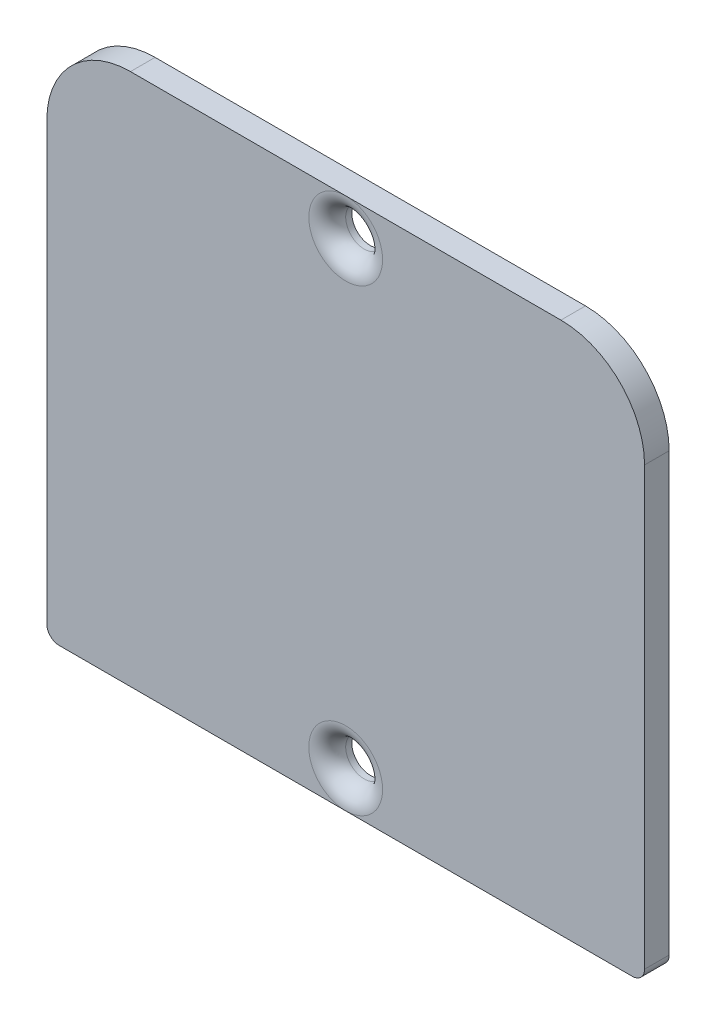
ISO-10303-21;
HEADER;
FILE_DESCRIPTION(('STEP AP214'),'2;1');
FILE_NAME('part.step','',(''),(''),'','','');
FILE_SCHEMA(('AUTOMOTIVE_DESIGN { 1 0 10303 214 1 1 1 1 }'));
ENDSEC;
DATA;
#1=APPLICATION_CONTEXT('core data for automotive mechanical design processes');
#2=APPLICATION_PROTOCOL_DEFINITION('international standard','automotive_design',2000,#1);
#3=PRODUCT_CONTEXT('',#1,'mechanical');
#4=PRODUCT('Part','Part','',(#3));
#5=PRODUCT_RELATED_PRODUCT_CATEGORY('part','',(#4));
#6=PRODUCT_DEFINITION_FORMATION('','',#4);
#7=PRODUCT_DEFINITION_CONTEXT('part definition',#1,'design');
#8=PRODUCT_DEFINITION('design','',#6,#7);
#9=PRODUCT_DEFINITION_SHAPE('','',#8);
#10=(LENGTH_UNIT() NAMED_UNIT(*) SI_UNIT(.MILLI.,.METRE.));
#11=(NAMED_UNIT(*) PLANE_ANGLE_UNIT() SI_UNIT($,.RADIAN.));
#12=(NAMED_UNIT(*) SI_UNIT($,.STERADIAN.) SOLID_ANGLE_UNIT());
#13=UNCERTAINTY_MEASURE_WITH_UNIT(LENGTH_MEASURE(1.E-05),#10,'distance_accuracy_value','');
#14=(GEOMETRIC_REPRESENTATION_CONTEXT(3) GLOBAL_UNCERTAINTY_ASSIGNED_CONTEXT((#13)) GLOBAL_UNIT_ASSIGNED_CONTEXT((#10,
#11,#12)) REPRESENTATION_CONTEXT('',''));
#15=CARTESIAN_POINT('',(0.,0.,0.));
#16=DIRECTION('',(0.,0.,1.));
#17=DIRECTION('',(1.,0.,0.));
#18=AXIS2_PLACEMENT_3D('',#15,#16,#17);
#19=CARTESIAN_POINT('',(-26.7639444422996,27.3351694915254,2.));
#20=DIRECTION('',(1.,0.,0.));
#21=DIRECTION('',(0.,1.,0.));
#22=AXIS2_PLACEMENT_3D('',#19,#20,#21);
#23=PLANE('',#22);
#24=DIRECTION('',(0.,-1.,0.));
#25=VECTOR('',#24,1.);
#26=CARTESIAN_POINT('',(-26.7639444422996,27.3351694915254,0.));
#27=LINE('',#26,#25);
#28=CARTESIAN_POINT('',(-26.7639444422996,20.5351694915254,0.));
#29=VERTEX_POINT('',#28);
#30=CARTESIAN_POINT('',(-26.7639444422996,-14.9748305084746,0.));
#31=VERTEX_POINT('',#30);
#32=EDGE_CURVE('E128',#29,#31,#27,.T.);
#33=ORIENTED_EDGE('',*,*,#32,.T.);
#34=DIRECTION('',(0.,0.,-1.));
#35=VECTOR('',#34,1.);
#36=CARTESIAN_POINT('',(-26.7639444422996,-14.9748305084746,2.));
#37=LINE('',#36,#35);
#38=CARTESIAN_POINT('',(-26.7639444422996,-14.9748305084746,2.));
#39=VERTEX_POINT('',#38);
#40=EDGE_CURVE('E200',#31,#39,#37,.F.);
#41=ORIENTED_EDGE('',*,*,#40,.T.);
#42=DIRECTION('',(0.,-1.,0.));
#43=VECTOR('',#42,1.);
#44=CARTESIAN_POINT('',(-26.7639444422996,27.3351694915254,2.));
#45=LINE('',#44,#43);
#46=CARTESIAN_POINT('',(-26.7639444422996,20.5351694915254,2.));
#47=VERTEX_POINT('',#46);
#48=EDGE_CURVE('E131',#47,#39,#45,.T.);
#49=ORIENTED_EDGE('',*,*,#48,.F.);
#50=DIRECTION('',(0.,0.,-1.));
#51=VECTOR('',#50,1.);
#52=CARTESIAN_POINT('',(-26.7639444422996,20.5351694915254,2.));
#53=LINE('',#52,#51);
#54=EDGE_CURVE('E114',#47,#29,#53,.T.);
#55=ORIENTED_EDGE('',*,*,#54,.T.);
#56=EDGE_LOOP('',(#33,#41,#49,#55));
#57=FACE_BOUND('',#56,.T.);
#58=ADVANCED_FACE('F42',(#57),#23,.F.);
#59=CARTESIAN_POINT('',(-26.7639444422996,-15.9748305084746,2.));
#60=DIRECTION('',(0.,1.,0.));
#61=DIRECTION('',(0.,0.,1.));
#62=AXIS2_PLACEMENT_3D('',#59,#60,#61);
#63=PLANE('',#62);
#64=DIRECTION('',(1.,0.,0.));
#65=VECTOR('',#64,1.);
#66=CARTESIAN_POINT('',(-26.7639444422996,-15.9748305084746,0.));
#67=LINE('',#66,#65);
#68=CARTESIAN_POINT('',(-25.7639444422995,-15.9748305084746,0.));
#69=VERTEX_POINT('',#68);
#70=CARTESIAN_POINT('',(20.8360555577005,-15.9748305084746,0.));
#71=VERTEX_POINT('',#70);
#72=EDGE_CURVE('E140',#69,#71,#67,.T.);
#73=ORIENTED_EDGE('',*,*,#72,.T.);
#74=DIRECTION('',(0.,0.,-1.));
#75=VECTOR('',#74,1.);
#76=CARTESIAN_POINT('',(20.8360555577005,-15.9748305084746,2.));
#77=LINE('',#76,#75);
#78=CARTESIAN_POINT('',(20.8360555577005,-15.9748305084746,2.));
#79=VERTEX_POINT('',#78);
#80=EDGE_CURVE('E190',#71,#79,#77,.F.);
#81=ORIENTED_EDGE('',*,*,#80,.T.);
#82=DIRECTION('',(1.,0.,0.));
#83=VECTOR('',#82,1.);
#84=CARTESIAN_POINT('',(-26.7639444422996,-15.9748305084746,2.));
#85=LINE('',#84,#83);
#86=CARTESIAN_POINT('',(-2.46394444229955,-15.9748305084746,2.));
#87=VERTEX_POINT('',#86);
#88=EDGE_CURVE('E261',#87,#79,#85,.T.);
#89=ORIENTED_EDGE('',*,*,#88,.F.);
#90=CARTESIAN_POINT('',(-25.7639444422995,-15.9748305084746,2.));
#91=VERTEX_POINT('',#90);
#92=EDGE_CURVE('E259',#91,#87,#85,.T.);
#93=ORIENTED_EDGE('',*,*,#92,.F.);
#94=DIRECTION('',(0.,0.,-1.));
#95=VECTOR('',#94,1.);
#96=CARTESIAN_POINT('',(-25.7639444422995,-15.9748305084746,2.));
#97=LINE('',#96,#95);
#98=EDGE_CURVE('E186',#91,#69,#97,.T.);
#99=ORIENTED_EDGE('',*,*,#98,.T.);
#100=EDGE_LOOP('',(#73,#81,#89,#93,#99));
#101=FACE_BOUND('',#100,.T.);
#102=ADVANCED_FACE('F225',(#101),#63,.F.);
#103=CARTESIAN_POINT('',(21.8360555577005,27.3351694915254,2.));
#104=DIRECTION('',(-1.,0.,0.));
#105=DIRECTION('',(0.,0.,1.));
#106=AXIS2_PLACEMENT_3D('',#103,#104,#105);
#107=PLANE('',#106);
#108=DIRECTION('',(0.,1.,0.));
#109=VECTOR('',#108,1.);
#110=CARTESIAN_POINT('',(21.8360555577005,27.3351694915254,2.));
#111=LINE('',#110,#109);
#112=CARTESIAN_POINT('',(21.8360555577005,-14.9748305084746,2.));
#113=VERTEX_POINT('',#112);
#114=CARTESIAN_POINT('',(21.8360555577005,20.5351694915254,2.));
#115=VERTEX_POINT('',#114);
#116=EDGE_CURVE('E263',#113,#115,#111,.T.);
#117=ORIENTED_EDGE('',*,*,#116,.F.);
#118=DIRECTION('',(0.,0.,-1.));
#119=VECTOR('',#118,1.);
#120=CARTESIAN_POINT('',(21.8360555577005,-14.9748305084746,2.));
#121=LINE('',#120,#119);
#122=CARTESIAN_POINT('',(21.8360555577005,-14.9748305084746,0.));
#123=VERTEX_POINT('',#122);
#124=EDGE_CURVE('E177',#113,#123,#121,.T.);
#125=ORIENTED_EDGE('',*,*,#124,.T.);
#126=DIRECTION('',(0.,1.,0.));
#127=VECTOR('',#126,1.);
#128=CARTESIAN_POINT('',(21.8360555577005,27.3351694915254,0.));
#129=LINE('',#128,#127);
#130=CARTESIAN_POINT('',(21.8360555577005,20.5351694915254,0.));
#131=VERTEX_POINT('',#130);
#132=EDGE_CURVE('E146',#123,#131,#129,.T.);
#133=ORIENTED_EDGE('',*,*,#132,.T.);
#134=DIRECTION('',(0.,0.,-1.));
#135=VECTOR('',#134,1.);
#136=CARTESIAN_POINT('',(21.8360555577005,20.5351694915254,2.));
#137=LINE('',#136,#135);
#138=EDGE_CURVE('E173',#131,#115,#137,.F.);
#139=ORIENTED_EDGE('',*,*,#138,.T.);
#140=EDGE_LOOP('',(#117,#125,#133,#139));
#141=FACE_BOUND('',#140,.T.);
#142=ADVANCED_FACE('F231',(#141),#107,.F.);
#143=CARTESIAN_POINT('',(-26.7639444422996,27.3351694915254,2.));
#144=DIRECTION('',(0.,-1.,0.));
#145=DIRECTION('',(0.,0.,-1.));
#146=AXIS2_PLACEMENT_3D('',#143,#144,#145);
#147=PLANE('',#146);
#148=DIRECTION('',(-1.,0.,0.));
#149=VECTOR('',#148,1.);
#150=CARTESIAN_POINT('',(-26.7639444422996,27.3351694915254,0.));
#151=LINE('',#150,#149);
#152=CARTESIAN_POINT('',(15.0360555577005,27.3351694915254,0.));
#153=VERTEX_POINT('',#152);
#154=CARTESIAN_POINT('',(-19.9639444422996,27.3351694915254,0.));
#155=VERTEX_POINT('',#154);
#156=EDGE_CURVE('E156',#153,#155,#151,.T.);
#157=ORIENTED_EDGE('',*,*,#156,.T.);
#158=DIRECTION('',(0.,0.,-1.));
#159=VECTOR('',#158,1.);
#160=CARTESIAN_POINT('',(-19.9639444422996,27.3351694915254,2.));
#161=LINE('',#160,#159);
#162=CARTESIAN_POINT('',(-19.9639444422996,27.3351694915254,2.));
#163=VERTEX_POINT('',#162);
#164=EDGE_CURVE('E116',#155,#163,#161,.F.);
#165=ORIENTED_EDGE('',*,*,#164,.T.);
#166=DIRECTION('',(-1.,0.,0.));
#167=VECTOR('',#166,1.);
#168=CARTESIAN_POINT('',(-26.7639444422996,27.3351694915254,2.));
#169=LINE('',#168,#167);
#170=CARTESIAN_POINT('',(-2.46394444229955,27.3351694915254,2.));
#171=VERTEX_POINT('',#170);
#172=EDGE_CURVE('E267',#171,#163,#169,.T.);
#173=ORIENTED_EDGE('',*,*,#172,.F.);
#174=CARTESIAN_POINT('',(15.0360555577005,27.3351694915254,2.));
#175=VERTEX_POINT('',#174);
#176=EDGE_CURVE('E133',#175,#171,#169,.T.);
#177=ORIENTED_EDGE('',*,*,#176,.F.);
#178=DIRECTION('',(0.,0.,-1.));
#179=VECTOR('',#178,1.);
#180=CARTESIAN_POINT('',(15.0360555577005,27.3351694915254,2.));
#181=LINE('',#180,#179);
#182=EDGE_CURVE('E122',#175,#153,#181,.T.);
#183=ORIENTED_EDGE('',*,*,#182,.T.);
#184=EDGE_LOOP('',(#157,#165,#173,#177,#183));
#185=FACE_BOUND('',#184,.T.);
#186=ADVANCED_FACE('F282',(#185),#147,.F.);
#187=CARTESIAN_POINT('',(0.,0.,2.));
#188=DIRECTION('',(0.,0.,1.));
#189=DIRECTION('',(1.,0.,0.));
#190=AXIS2_PLACEMENT_3D('',#187,#188,#189);
#191=PLANE('',#190);
#192=ORIENTED_EDGE('',*,*,#92,.T.);
#193=CARTESIAN_POINT('',(-2.46394444229955,-12.9748305084746,2.));
#194=DIRECTION('',(0.,0.,1.));
#195=DIRECTION('',(1.,0.,0.));
#196=AXIS2_PLACEMENT_3D('',#193,#194,#195);
#197=CIRCLE('',#196,3.);
#198=EDGE_CURVE('E11',#87,#87,#197,.F.);
#199=ORIENTED_EDGE('',*,*,#198,.T.);
#200=ORIENTED_EDGE('',*,*,#88,.T.);
#201=CARTESIAN_POINT('',(20.8360555577005,-14.9748305084746,2.));
#202=DIRECTION('',(0.,0.,1.));
#203=DIRECTION('',(1.,0.,0.));
#204=AXIS2_PLACEMENT_3D('',#201,#202,#203);
#205=CIRCLE('',#204,1.);
#206=EDGE_CURVE('E197',#79,#113,#205,.T.);
#207=ORIENTED_EDGE('',*,*,#206,.T.);
#208=ORIENTED_EDGE('',*,*,#116,.T.);
#209=CARTESIAN_POINT('',(15.0360555577005,20.5351694915254,2.));
#210=DIRECTION('',(0.,0.,1.));
#211=DIRECTION('',(1.,0.,0.));
#212=AXIS2_PLACEMENT_3D('',#209,#210,#211);
#213=CIRCLE('',#212,6.8);
#214=EDGE_CURVE('E167',#115,#175,#213,.T.);
#215=ORIENTED_EDGE('',*,*,#214,.T.);
#216=ORIENTED_EDGE('',*,*,#176,.T.);
#217=CARTESIAN_POINT('',(-2.46394444229955,24.3351694915254,2.));
#218=DIRECTION('',(0.,0.,1.));
#219=DIRECTION('',(1.,0.,0.));
#220=AXIS2_PLACEMENT_3D('',#217,#218,#219);
#221=CIRCLE('',#220,3.);
#222=EDGE_CURVE('E59',#171,#171,#221,.F.);
#223=ORIENTED_EDGE('',*,*,#222,.T.);
#224=ORIENTED_EDGE('',*,*,#172,.T.);
#225=CARTESIAN_POINT('',(-19.9639444422996,20.5351694915254,2.));
#226=DIRECTION('',(0.,0.,1.));
#227=DIRECTION('',(1.,0.,0.));
#228=AXIS2_PLACEMENT_3D('',#225,#226,#227);
#229=CIRCLE('',#228,6.8);
#230=EDGE_CURVE('E170',#163,#47,#229,.T.);
#231=ORIENTED_EDGE('',*,*,#230,.T.);
#232=ORIENTED_EDGE('',*,*,#48,.T.);
#233=CARTESIAN_POINT('',(-25.7639444422995,-14.9748305084746,2.));
#234=DIRECTION('',(0.,0.,1.));
#235=DIRECTION('',(1.,0.,0.));
#236=AXIS2_PLACEMENT_3D('',#233,#234,#235);
#237=CIRCLE('',#236,1.);
#238=EDGE_CURVE('E194',#39,#91,#237,.T.);
#239=ORIENTED_EDGE('',*,*,#238,.T.);
#240=EDGE_LOOP('',(#192,#199,#200,#207,#208,#215,#216,#223,#224,#231,#232,#239));
#241=FACE_BOUND('',#240,.T.);
#242=ADVANCED_FACE('F258',(#241),#191,.T.);
#243=CARTESIAN_POINT('',(0.,0.,0.));
#244=DIRECTION('',(0.,0.,1.));
#245=DIRECTION('',(1.,0.,0.));
#246=AXIS2_PLACEMENT_3D('',#243,#244,#245);
#247=PLANE('',#246);
#248=CARTESIAN_POINT('',(-2.46394444229955,24.3351694915254,0.));
#249=DIRECTION('',(0.,0.,1.));
#250=DIRECTION('',(1.,0.,0.));
#251=AXIS2_PLACEMENT_3D('',#248,#249,#250);
#252=CIRCLE('',#251,1.5);
#253=CARTESIAN_POINT('',(-0.963944442299545,24.3351694915254,0.));
#254=VERTEX_POINT('',#253);
#255=EDGE_CURVE('E141',#254,#254,#252,.T.);
#256=ORIENTED_EDGE('',*,*,#255,.T.);
#257=EDGE_LOOP('',(#256));
#258=FACE_BOUND('',#257,.T.);
#259=CARTESIAN_POINT('',(-2.46394444229955,-12.9748305084746,0.));
#260=DIRECTION('',(0.,0.,1.));
#261=DIRECTION('',(1.,0.,0.));
#262=AXIS2_PLACEMENT_3D('',#259,#260,#261);
#263=CIRCLE('',#262,1.5);
#264=CARTESIAN_POINT('',(-0.963944442299547,-12.9748305084746,0.));
#265=VERTEX_POINT('',#264);
#266=EDGE_CURVE('E149',#265,#265,#263,.T.);
#267=ORIENTED_EDGE('',*,*,#266,.T.);
#268=EDGE_LOOP('',(#267));
#269=FACE_BOUND('',#268,.T.);
#270=ORIENTED_EDGE('',*,*,#132,.F.);
#271=CARTESIAN_POINT('',(20.8360555577005,-14.9748305084746,0.));
#272=DIRECTION('',(0.,0.,1.));
#273=DIRECTION('',(1.,0.,0.));
#274=AXIS2_PLACEMENT_3D('',#271,#272,#273);
#275=CIRCLE('',#274,1.);
#276=EDGE_CURVE('E183',#123,#71,#275,.F.);
#277=ORIENTED_EDGE('',*,*,#276,.T.);
#278=ORIENTED_EDGE('',*,*,#72,.F.);
#279=CARTESIAN_POINT('',(-25.7639444422995,-14.9748305084746,0.));
#280=DIRECTION('',(0.,0.,1.));
#281=DIRECTION('',(1.,0.,0.));
#282=AXIS2_PLACEMENT_3D('',#279,#280,#281);
#283=CIRCLE('',#282,1.);
#284=EDGE_CURVE('E138',#69,#31,#283,.F.);
#285=ORIENTED_EDGE('',*,*,#284,.T.);
#286=ORIENTED_EDGE('',*,*,#32,.F.);
#287=CARTESIAN_POINT('',(-19.9639444422996,20.5351694915254,0.));
#288=DIRECTION('',(0.,0.,1.));
#289=DIRECTION('',(1.,0.,0.));
#290=AXIS2_PLACEMENT_3D('',#287,#288,#289);
#291=CIRCLE('',#290,6.8);
#292=EDGE_CURVE('E110',#29,#155,#291,.F.);
#293=ORIENTED_EDGE('',*,*,#292,.T.);
#294=ORIENTED_EDGE('',*,*,#156,.F.);
#295=CARTESIAN_POINT('',(15.0360555577005,20.5351694915254,0.));
#296=DIRECTION('',(0.,0.,1.));
#297=DIRECTION('',(1.,0.,0.));
#298=AXIS2_PLACEMENT_3D('',#295,#296,#297);
#299=CIRCLE('',#298,6.8);
#300=EDGE_CURVE('E123',#153,#131,#299,.F.);
#301=ORIENTED_EDGE('',*,*,#300,.T.);
#302=EDGE_LOOP('',(#270,#277,#278,#285,#286,#293,#294,#301));
#303=FACE_BOUND('',#302,.T.);
#304=ADVANCED_FACE('F136',(#258,#269,#303),#247,.F.);
#305=CARTESIAN_POINT('',(-19.9639444422996,20.5351694915254,2.));
#306=DIRECTION('',(0.,0.,-1.));
#307=DIRECTION('',(-1.,0.,0.));
#308=AXIS2_PLACEMENT_3D('',#305,#306,#307);
#309=CYLINDRICAL_SURFACE('',#308,6.8);
#310=ORIENTED_EDGE('',*,*,#230,.F.);
#311=ORIENTED_EDGE('',*,*,#164,.F.);
#312=ORIENTED_EDGE('',*,*,#292,.F.);
#313=ORIENTED_EDGE('',*,*,#54,.F.);
#314=EDGE_LOOP('',(#310,#311,#312,#313));
#315=FACE_BOUND('',#314,.T.);
#316=ADVANCED_FACE('F113',(#315),#309,.T.);
#317=CARTESIAN_POINT('',(15.0360555577005,20.5351694915254,2.));
#318=DIRECTION('',(0.,0.,-1.));
#319=DIRECTION('',(-1.,0.,0.));
#320=AXIS2_PLACEMENT_3D('',#317,#318,#319);
#321=CYLINDRICAL_SURFACE('',#320,6.8);
#322=ORIENTED_EDGE('',*,*,#214,.F.);
#323=ORIENTED_EDGE('',*,*,#138,.F.);
#324=ORIENTED_EDGE('',*,*,#300,.F.);
#325=ORIENTED_EDGE('',*,*,#182,.F.);
#326=EDGE_LOOP('',(#322,#323,#324,#325));
#327=FACE_BOUND('',#326,.T.);
#328=ADVANCED_FACE('F238',(#327),#321,.T.);
#329=CARTESIAN_POINT('',(20.8360555577005,-14.9748305084746,2.));
#330=DIRECTION('',(0.,0.,-1.));
#331=DIRECTION('',(-1.,0.,0.));
#332=AXIS2_PLACEMENT_3D('',#329,#330,#331);
#333=CYLINDRICAL_SURFACE('',#332,1.);
#334=ORIENTED_EDGE('',*,*,#206,.F.);
#335=ORIENTED_EDGE('',*,*,#80,.F.);
#336=ORIENTED_EDGE('',*,*,#276,.F.);
#337=ORIENTED_EDGE('',*,*,#124,.F.);
#338=EDGE_LOOP('',(#334,#335,#336,#337));
#339=FACE_BOUND('',#338,.T.);
#340=ADVANCED_FACE('F241',(#339),#333,.T.);
#341=CARTESIAN_POINT('',(-25.7639444422995,-14.9748305084746,2.));
#342=DIRECTION('',(0.,0.,-1.));
#343=DIRECTION('',(-1.,0.,0.));
#344=AXIS2_PLACEMENT_3D('',#341,#342,#343);
#345=CYLINDRICAL_SURFACE('',#344,1.);
#346=ORIENTED_EDGE('',*,*,#238,.F.);
#347=ORIENTED_EDGE('',*,*,#40,.F.);
#348=ORIENTED_EDGE('',*,*,#284,.F.);
#349=ORIENTED_EDGE('',*,*,#98,.F.);
#350=EDGE_LOOP('',(#346,#347,#348,#349));
#351=FACE_BOUND('',#350,.T.);
#352=ADVANCED_FACE('F245',(#351),#345,.T.);
#353=CARTESIAN_POINT('',(-2.46394444229955,-12.9748305084746,-9.));
#354=DIRECTION('',(0.,0.,1.));
#355=DIRECTION('',(1.,0.,0.));
#356=AXIS2_PLACEMENT_3D('',#353,#354,#355);
#357=CYLINDRICAL_SURFACE('',#356,1.5);
#358=CARTESIAN_POINT('',(-2.46394444229955,-12.9748305084746,0.5));
#359=DIRECTION('',(0.,0.,1.));
#360=DIRECTION('',(1.,0.,0.));
#361=AXIS2_PLACEMENT_3D('',#358,#359,#360);
#362=CIRCLE('',#361,1.5);
#363=CARTESIAN_POINT('',(-0.963944442299547,-12.9748305084746,0.5));
#364=VERTEX_POINT('',#363);
#365=EDGE_CURVE('E51',#364,#364,#362,.T.);
#366=ORIENTED_EDGE('',*,*,#365,.T.);
#367=EDGE_LOOP('',(#366));
#368=FACE_BOUND('',#367,.T.);
#369=ORIENTED_EDGE('',*,*,#266,.F.);
#370=EDGE_LOOP('',(#369));
#371=FACE_BOUND('',#370,.T.);
#372=ADVANCED_FACE('F215',(#368,#371),#357,.F.);
#373=CARTESIAN_POINT('',(-2.46394444229955,24.3351694915254,-9.));
#374=DIRECTION('',(0.,0.,1.));
#375=DIRECTION('',(1.,0.,0.));
#376=AXIS2_PLACEMENT_3D('',#373,#374,#375);
#377=CYLINDRICAL_SURFACE('',#376,1.5);
#378=CARTESIAN_POINT('',(-2.46394444229955,24.3351694915254,0.5));
#379=DIRECTION('',(0.,0.,1.));
#380=DIRECTION('',(1.,0.,0.));
#381=AXIS2_PLACEMENT_3D('',#378,#379,#380);
#382=CIRCLE('',#381,1.5);
#383=CARTESIAN_POINT('',(-0.963944442299545,24.3351694915254,0.5));
#384=VERTEX_POINT('',#383);
#385=EDGE_CURVE('E203',#384,#384,#382,.T.);
#386=ORIENTED_EDGE('',*,*,#385,.T.);
#387=EDGE_LOOP('',(#386));
#388=FACE_BOUND('',#387,.T.);
#389=ORIENTED_EDGE('',*,*,#255,.F.);
#390=EDGE_LOOP('',(#389));
#391=FACE_BOUND('',#390,.T.);
#392=ADVANCED_FACE('F223',(#388,#391),#377,.F.);
#393=CARTESIAN_POINT('',(-2.46394444229955,24.3351694915254,0.5));
#394=DIRECTION('',(0.,0.,1.));
#395=DIRECTION('',(1.,0.,0.));
#396=AXIS2_PLACEMENT_3D('',#393,#394,#395);
#397=TOROIDAL_SURFACE('',#396,3.,1.5);
#398=ORIENTED_EDGE('',*,*,#222,.F.);
#399=EDGE_LOOP('',(#398));
#400=FACE_BOUND('',#399,.T.);
#401=ORIENTED_EDGE('',*,*,#385,.F.);
#402=EDGE_LOOP('',(#401));
#403=FACE_BOUND('',#402,.T.);
#404=ADVANCED_FACE('F219',(#400,#403),#397,.T.);
#405=CARTESIAN_POINT('',(-2.46394444229955,-12.9748305084746,0.5));
#406=DIRECTION('',(0.,0.,1.));
#407=DIRECTION('',(1.,0.,0.));
#408=AXIS2_PLACEMENT_3D('',#405,#406,#407);
#409=TOROIDAL_SURFACE('',#408,3.,1.5);
#410=ORIENTED_EDGE('',*,*,#198,.F.);
#411=EDGE_LOOP('',(#410));
#412=FACE_BOUND('',#411,.T.);
#413=ORIENTED_EDGE('',*,*,#365,.F.);
#414=EDGE_LOOP('',(#413));
#415=FACE_BOUND('',#414,.T.);
#416=ADVANCED_FACE('F44',(#412,#415),#409,.T.);
#417=CLOSED_SHELL('',(#58,#102,#142,#186,#242,#304,#316,#328,#340,#352,#372,#392,#404,#416));
#418=MANIFOLD_SOLID_BREP('B2',#417);
#419=ADVANCED_BREP_SHAPE_REPRESENTATION('',(#18,#418),#14);
#420=SHAPE_DEFINITION_REPRESENTATION(#9,#419);
ENDSEC;
END-ISO-10303-21;
